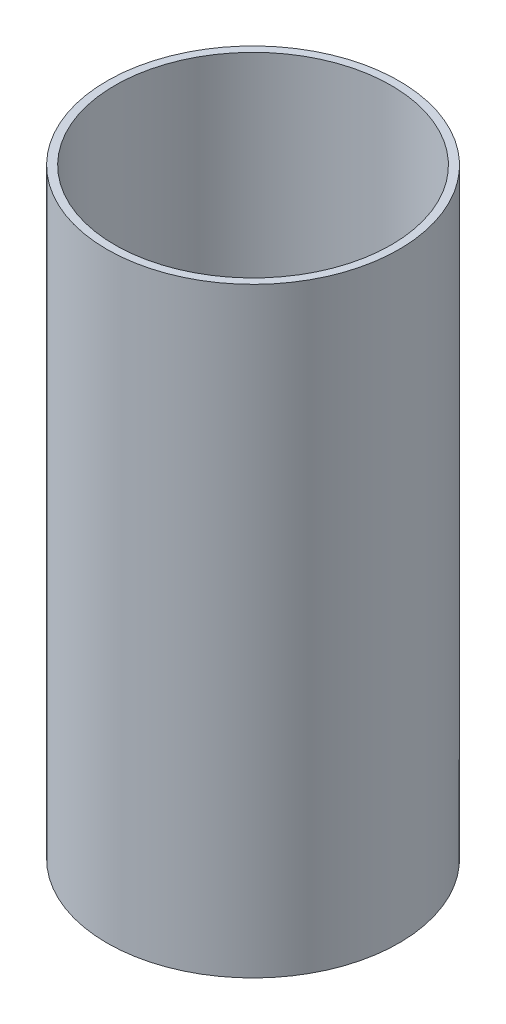
ISO-10303-21;
HEADER;
FILE_DESCRIPTION(('STEP AP214'),'2;1');
FILE_NAME('part.step','',(''),(''),'','','');
FILE_SCHEMA(('AUTOMOTIVE_DESIGN { 1 0 10303 214 1 1 1 1 }'));
ENDSEC;
DATA;
#1=APPLICATION_CONTEXT('core data for automotive mechanical design processes');
#2=APPLICATION_PROTOCOL_DEFINITION('international standard','automotive_design',2000,#1);
#3=PRODUCT_CONTEXT('',#1,'mechanical');
#4=PRODUCT('Part','Part','',(#3));
#5=PRODUCT_RELATED_PRODUCT_CATEGORY('part','',(#4));
#6=PRODUCT_DEFINITION_FORMATION('','',#4);
#7=PRODUCT_DEFINITION_CONTEXT('part definition',#1,'design');
#8=PRODUCT_DEFINITION('design','',#6,#7);
#9=PRODUCT_DEFINITION_SHAPE('','',#8);
#10=(LENGTH_UNIT() NAMED_UNIT(*) SI_UNIT(.MILLI.,.METRE.));
#11=(NAMED_UNIT(*) PLANE_ANGLE_UNIT() SI_UNIT($,.RADIAN.));
#12=(NAMED_UNIT(*) SI_UNIT($,.STERADIAN.) SOLID_ANGLE_UNIT());
#13=UNCERTAINTY_MEASURE_WITH_UNIT(LENGTH_MEASURE(1.E-05),#10,'distance_accuracy_value','');
#14=(GEOMETRIC_REPRESENTATION_CONTEXT(3) GLOBAL_UNCERTAINTY_ASSIGNED_CONTEXT((#13)) GLOBAL_UNIT_ASSIGNED_CONTEXT((#10,
#11,#12)) REPRESENTATION_CONTEXT('',''));
#15=CARTESIAN_POINT('',(0.,0.,0.));
#16=DIRECTION('',(0.,0.,1.));
#17=DIRECTION('',(1.,0.,0.));
#18=AXIS2_PLACEMENT_3D('',#15,#16,#17);
#19=CARTESIAN_POINT('',(0.,288.,0.));
#20=DIRECTION('',(0.,1.,0.));
#21=DIRECTION('',(0.,0.,1.));
#22=AXIS2_PLACEMENT_3D('',#19,#20,#21);
#23=PLANE('',#22);
#24=CARTESIAN_POINT('',(0.,288.,0.));
#25=DIRECTION('',(0.,1.,0.));
#26=DIRECTION('',(0.,0.,1.));
#27=AXIS2_PLACEMENT_3D('',#24,#25,#26);
#28=CIRCLE('',#27,70.);
#29=CARTESIAN_POINT('',(0.,288.,70.));
#30=VERTEX_POINT('',#29);
#31=EDGE_CURVE('E11',#30,#30,#28,.T.);
#32=ORIENTED_EDGE('',*,*,#31,.T.);
#33=EDGE_LOOP('',(#32));
#34=FACE_BOUND('',#33,.T.);
#35=CARTESIAN_POINT('',(0.,288.,0.));
#36=DIRECTION('',(0.,1.,0.));
#37=DIRECTION('',(1.,0.,0.));
#38=AXIS2_PLACEMENT_3D('',#35,#36,#37);
#39=CIRCLE('',#38,66.25);
#40=CARTESIAN_POINT('',(66.25,288.,0.));
#41=VERTEX_POINT('',#40);
#42=EDGE_CURVE('E54',#41,#41,#39,.T.);
#43=ORIENTED_EDGE('',*,*,#42,.F.);
#44=EDGE_LOOP('',(#43));
#45=FACE_BOUND('',#44,.T.);
#46=ADVANCED_FACE('F43',(#34,#45),#23,.T.);
#47=CARTESIAN_POINT('',(0.,0.,0.));
#48=DIRECTION('',(0.,1.,0.));
#49=DIRECTION('',(0.,0.,1.));
#50=AXIS2_PLACEMENT_3D('',#47,#48,#49);
#51=PLANE('',#50);
#52=CARTESIAN_POINT('',(0.,0.,0.));
#53=DIRECTION('',(0.,1.,0.));
#54=DIRECTION('',(0.,0.,1.));
#55=AXIS2_PLACEMENT_3D('',#52,#53,#54);
#56=CIRCLE('',#55,70.);
#57=CARTESIAN_POINT('',(0.,0.,70.));
#58=VERTEX_POINT('',#57);
#59=EDGE_CURVE('E47',#58,#58,#56,.T.);
#60=ORIENTED_EDGE('',*,*,#59,.F.);
#61=EDGE_LOOP('',(#60));
#62=FACE_BOUND('',#61,.T.);
#63=CARTESIAN_POINT('',(0.,0.,0.));
#64=DIRECTION('',(0.,1.,0.));
#65=DIRECTION('',(1.,0.,0.));
#66=AXIS2_PLACEMENT_3D('',#63,#64,#65);
#67=CIRCLE('',#66,66.25);
#68=CARTESIAN_POINT('',(66.25,0.,0.));
#69=VERTEX_POINT('',#68);
#70=EDGE_CURVE('E56',#69,#69,#67,.T.);
#71=ORIENTED_EDGE('',*,*,#70,.T.);
#72=EDGE_LOOP('',(#71));
#73=FACE_BOUND('',#72,.T.);
#74=ADVANCED_FACE('F66',(#62,#73),#51,.F.);
#75=CARTESIAN_POINT('',(0.,288.,0.));
#76=DIRECTION('',(0.,-1.,0.));
#77=DIRECTION('',(0.,0.,-1.));
#78=AXIS2_PLACEMENT_3D('',#75,#76,#77);
#79=CYLINDRICAL_SURFACE('',#78,70.);
#80=ORIENTED_EDGE('',*,*,#31,.F.);
#81=EDGE_LOOP('',(#80));
#82=FACE_BOUND('',#81,.T.);
#83=ORIENTED_EDGE('',*,*,#59,.T.);
#84=EDGE_LOOP('',(#83));
#85=FACE_BOUND('',#84,.T.);
#86=ADVANCED_FACE('F45',(#82,#85),#79,.T.);
#87=CARTESIAN_POINT('',(0.,288.,0.));
#88=DIRECTION('',(0.,-1.,0.));
#89=DIRECTION('',(0.,0.,-1.));
#90=AXIS2_PLACEMENT_3D('',#87,#88,#89);
#91=CYLINDRICAL_SURFACE('',#90,66.25);
#92=ORIENTED_EDGE('',*,*,#42,.T.);
#93=EDGE_LOOP('',(#92));
#94=FACE_BOUND('',#93,.T.);
#95=ORIENTED_EDGE('',*,*,#70,.F.);
#96=EDGE_LOOP('',(#95));
#97=FACE_BOUND('',#96,.T.);
#98=ADVANCED_FACE('F62',(#94,#97),#91,.F.);
#99=CLOSED_SHELL('',(#46,#74,#86,#98));
#100=MANIFOLD_SOLID_BREP('B2',#99);
#101=ADVANCED_BREP_SHAPE_REPRESENTATION('',(#18,#100),#14);
#102=SHAPE_DEFINITION_REPRESENTATION(#9,#101);
ENDSEC;
END-ISO-10303-21;
